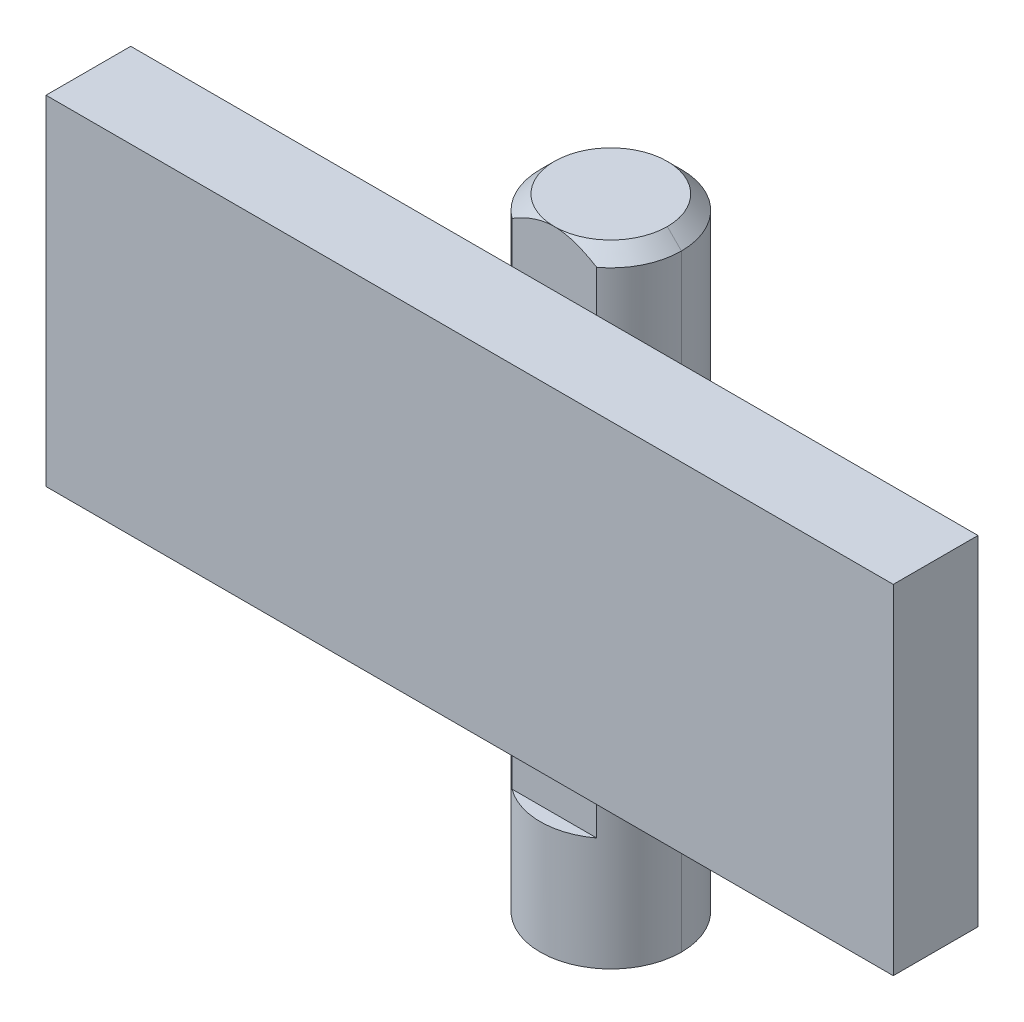
ISO-10303-21;
HEADER;
FILE_DESCRIPTION(('STEP AP214'),'2;1');
FILE_NAME('part.step','',(''),(''),'','','');
FILE_SCHEMA(('AUTOMOTIVE_DESIGN { 1 0 10303 214 1 1 1 1 }'));
ENDSEC;
DATA;
#1=APPLICATION_CONTEXT('core data for automotive mechanical design processes');
#2=APPLICATION_PROTOCOL_DEFINITION('international standard','automotive_design',2000,#1);
#3=PRODUCT_CONTEXT('',#1,'mechanical');
#4=PRODUCT('Part','Part','',(#3));
#5=PRODUCT_RELATED_PRODUCT_CATEGORY('part','',(#4));
#6=PRODUCT_DEFINITION_FORMATION('','',#4);
#7=PRODUCT_DEFINITION_CONTEXT('part definition',#1,'design');
#8=PRODUCT_DEFINITION('design','',#6,#7);
#9=PRODUCT_DEFINITION_SHAPE('','',#8);
#10=(LENGTH_UNIT() NAMED_UNIT(*) SI_UNIT(.MILLI.,.METRE.));
#11=(NAMED_UNIT(*) PLANE_ANGLE_UNIT() SI_UNIT($,.RADIAN.));
#12=(NAMED_UNIT(*) SI_UNIT($,.STERADIAN.) SOLID_ANGLE_UNIT());
#13=UNCERTAINTY_MEASURE_WITH_UNIT(LENGTH_MEASURE(1.E-05),#10,'distance_accuracy_value','');
#14=(GEOMETRIC_REPRESENTATION_CONTEXT(3) GLOBAL_UNCERTAINTY_ASSIGNED_CONTEXT((#13)) GLOBAL_UNIT_ASSIGNED_CONTEXT((#10,
#11,#12)) REPRESENTATION_CONTEXT('',''));
#15=CARTESIAN_POINT('',(0.,0.,0.));
#16=DIRECTION('',(0.,0.,1.));
#17=DIRECTION('',(1.,0.,0.));
#18=AXIS2_PLACEMENT_3D('',#15,#16,#17);
#19=CARTESIAN_POINT('',(-16.698147188712,34.073425246824,60.73181520798));
#20=DIRECTION('',(0.,0.,-1.));
#21=DIRECTION('',(-1.,0.,0.));
#22=AXIS2_PLACEMENT_3D('',#19,#20,#21);
#23=PLANE('',#22);
#24=DIRECTION('',(-1.,0.,0.));
#25=VECTOR('',#24,1.);
#26=CARTESIAN_POINT('',(-3.198147188712,50.101061355301,60.73181520798));
#27=LINE('',#26,#25);
#28=CARTESIAN_POINT('',(-16.698147188712,50.101061355301,60.73181520798));
#29=VERTEX_POINT('',#28);
#30=CARTESIAN_POINT('',(-19.698147188712,50.101061355301,60.73181520798));
#31=VERTEX_POINT('',#30);
#32=EDGE_CURVE('E73',#29,#31,#27,.T.);
#33=ORIENTED_EDGE('',*,*,#32,.F.);
#34=DIRECTION('',(0.,1.,0.));
#35=VECTOR('',#34,1.);
#36=CARTESIAN_POINT('',(-16.698147188712,34.073425246824,60.73181520798));
#37=LINE('',#36,#35);
#38=CARTESIAN_POINT('',(-16.698147188712,51.573425246824,60.73181520798));
#39=VERTEX_POINT('',#38);
#40=EDGE_CURVE('E324',#29,#39,#37,.T.);
#41=ORIENTED_EDGE('',*,*,#40,.T.);
#42=CARTESIAN_POINT('',(-16.698147188712,51.573425246824,60.73181520798));
#43=CARTESIAN_POINT('',(-17.0838822003572,51.8048662538111,60.73181520798));
#44=CARTESIAN_POINT('',(-17.4157640386026,51.9258397669012,60.73181520798));
#45=CARTESIAN_POINT('',(-17.8206538291355,52.073425246824,60.73181520798));
#46=CARTESIAN_POINT('',(-18.198147188712,52.073425246824,60.73181520798));
#47=B_SPLINE_CURVE_WITH_KNOTS('',2,(#42,#43,#44,#45,#46),.UNSPECIFIED.,.F.,.F.,(3,2,3),(0.,0.5,
1.),.UNSPECIFIED.);
#48=CARTESIAN_POINT('',(-18.198147188712,52.073425246824,60.73181520798));
#49=VERTEX_POINT('',#48);
#50=EDGE_CURVE('E65',#39,#49,#47,.T.);
#51=ORIENTED_EDGE('',*,*,#50,.T.);
#52=CARTESIAN_POINT('',(-18.198147188712,52.073425246824,60.73181520798));
#53=CARTESIAN_POINT('',(-18.5763507562841,52.073425246824,60.73181520798));
#54=CARTESIAN_POINT('',(-18.9831177525499,51.9248957994828,60.73181520798));
#55=CARTESIAN_POINT('',(-19.3133109570888,51.8043269857979,60.73181520798));
#56=CARTESIAN_POINT('',(-19.698147188712,51.573425246824,60.73181520798));
#57=B_SPLINE_CURVE_WITH_KNOTS('',2,(#52,#53,#54,#55,#56),.UNSPECIFIED.,.F.,.F.,(3,2,3),(0.,0.5,
1.),.UNSPECIFIED.);
#58=CARTESIAN_POINT('',(-19.698147188712,51.573425246824,60.73181520798));
#59=VERTEX_POINT('',#58);
#60=EDGE_CURVE('E230',#49,#59,#57,.T.);
#61=ORIENTED_EDGE('',*,*,#60,.T.);
#62=DIRECTION('',(0.,1.,0.));
#63=VECTOR('',#62,1.);
#64=CARTESIAN_POINT('',(-19.698147188712,34.073425246824,60.73181520798));
#65=LINE('',#64,#63);
#66=EDGE_CURVE('E58',#31,#59,#65,.T.);
#67=ORIENTED_EDGE('',*,*,#66,.F.);
#68=EDGE_LOOP('',(#33,#41,#51,#61,#67));
#69=FACE_BOUND('',#68,.T.);
#70=ADVANCED_FACE('F53',(#69),#23,.F.);
#71=CARTESIAN_POINT('',(-18.198147188712,34.073425246824,58.73181520798));
#72=DIRECTION('',(0.,1.,0.));
#73=DIRECTION('',(0.,0.,1.));
#74=AXIS2_PLACEMENT_3D('',#71,#72,#73);
#75=PLANE('',#74);
#76=CARTESIAN_POINT('',(-18.198147188712,34.073425246824,58.73181520798));
#77=DIRECTION('',(0.,1.,0.));
#78=DIRECTION('',(-1.,0.,0.));
#79=AXIS2_PLACEMENT_3D('',#76,#77,#78);
#80=CIRCLE('',#79,2.5);
#81=CARTESIAN_POINT('',(-19.698147188712,34.073425246824,60.73181520798));
#82=VERTEX_POINT('',#81);
#83=CARTESIAN_POINT('',(-16.698147188712,34.073425246824,60.73181520798));
#84=VERTEX_POINT('',#83);
#85=EDGE_CURVE('E203',#82,#84,#80,.T.);
#86=ORIENTED_EDGE('',*,*,#85,.T.);
#87=DIRECTION('',(-1.,0.,0.));
#88=VECTOR('',#87,1.);
#89=CARTESIAN_POINT('',(-16.698147188712,34.073425246824,60.73181520798));
#90=LINE('',#89,#88);
#91=EDGE_CURVE('E11',#84,#82,#90,.T.);
#92=ORIENTED_EDGE('',*,*,#91,.T.);
#93=EDGE_LOOP('',(#86,#92));
#94=FACE_BOUND('',#93,.T.);
#95=ADVANCED_FACE('F280',(#94),#75,.T.);
#96=CARTESIAN_POINT('',(-16.698147188712,38.101061355301,60.73181520798));
#97=VERTEX_POINT('',#96);
#98=EDGE_CURVE('E206',#84,#97,#37,.T.);
#99=ORIENTED_EDGE('',*,*,#98,.T.);
#100=DIRECTION('',(-1.,0.,0.));
#101=VECTOR('',#100,1.);
#102=CARTESIAN_POINT('',(-3.198147188712,38.101061355301,60.73181520798));
#103=LINE('',#102,#101);
#104=CARTESIAN_POINT('',(-19.698147188712,38.101061355301,60.73181520798));
#105=VERTEX_POINT('',#104);
#106=EDGE_CURVE('E194',#97,#105,#103,.T.);
#107=ORIENTED_EDGE('',*,*,#106,.T.);
#108=EDGE_CURVE('E235',#82,#105,#65,.T.);
#109=ORIENTED_EDGE('',*,*,#108,.F.);
#110=ORIENTED_EDGE('',*,*,#91,.F.);
#111=EDGE_LOOP('',(#99,#107,#109,#110));
#112=FACE_BOUND('',#111,.T.);
#113=ADVANCED_FACE('F55',(#112),#23,.F.);
#114=CARTESIAN_POINT('',(-18.198147188712,52.073425246824,58.73181520798));
#115=DIRECTION('',(0.,-1.,0.));
#116=DIRECTION('',(1.,0.,0.));
#117=AXIS2_PLACEMENT_3D('',#114,#115,#116);
#118=CONICAL_SURFACE('',#117,2.,0.785398163397446);
#119=DIRECTION('',(0.707106781186546,-0.707106781186549,0.));
#120=VECTOR('',#119,1.);
#121=CARTESIAN_POINT('',(-16.198147188712,52.073425246824,58.73181520798));
#122=LINE('',#121,#120);
#123=CARTESIAN_POINT('',(-16.198147188712,52.073425246824,58.73181520798));
#124=VERTEX_POINT('',#123);
#125=CARTESIAN_POINT('',(-15.698147188712,51.573425246824,58.73181520798));
#126=VERTEX_POINT('',#125);
#127=EDGE_CURVE('E217',#124,#126,#122,.T.);
#128=ORIENTED_EDGE('',*,*,#127,.F.);
#129=CARTESIAN_POINT('',(-18.198147188712,52.073425246824,58.73181520798));
#130=DIRECTION('',(0.,1.,0.));
#131=DIRECTION('',(-1.,0.,0.));
#132=AXIS2_PLACEMENT_3D('',#129,#130,#131);
#133=CIRCLE('',#132,2.);
#134=EDGE_CURVE('E234',#49,#124,#133,.T.);
#135=ORIENTED_EDGE('',*,*,#134,.F.);
#136=ORIENTED_EDGE('',*,*,#50,.F.);
#137=CARTESIAN_POINT('',(-18.198147188712,51.573425246824,58.73181520798));
#138=DIRECTION('',(0.,-1.,0.));
#139=DIRECTION('',(-1.,0.,0.));
#140=AXIS2_PLACEMENT_3D('',#137,#138,#139);
#141=CIRCLE('',#140,2.5);
#142=EDGE_CURVE('E226',#126,#39,#141,.T.);
#143=ORIENTED_EDGE('',*,*,#142,.F.);
#144=EDGE_LOOP('',(#128,#135,#136,#143));
#145=FACE_BOUND('',#144,.T.);
#146=ADVANCED_FACE('F262',(#145),#118,.T.);
#147=CARTESIAN_POINT('',(-18.198147188712,30.073425246824,58.73181520798));
#148=DIRECTION('',(0.,1.,0.));
#149=DIRECTION('',(0.,0.,1.));
#150=AXIS2_PLACEMENT_3D('',#147,#148,#149);
#151=PLANE('',#150);
#152=CARTESIAN_POINT('',(-18.198147188712,30.073425246824,58.73181520798));
#153=DIRECTION('',(0.,1.,0.));
#154=DIRECTION('',(-1.,0.,0.));
#155=AXIS2_PLACEMENT_3D('',#152,#153,#154);
#156=CIRCLE('',#155,2.5);
#157=CARTESIAN_POINT('',(-15.698147188712,30.073425246824,58.73181520798));
#158=VERTEX_POINT('',#157);
#159=CARTESIAN_POINT('',(-20.698147188712,30.073425246824,58.73181520798));
#160=VERTEX_POINT('',#159);
#161=EDGE_CURVE('E231',#158,#160,#156,.T.);
#162=ORIENTED_EDGE('',*,*,#161,.F.);
#163=CARTESIAN_POINT('',(-18.198147188712,30.073425246824,58.73181520798));
#164=DIRECTION('',(0.,1.,0.));
#165=DIRECTION('',(-1.,0.,0.));
#166=AXIS2_PLACEMENT_3D('',#163,#164,#165);
#167=CIRCLE('',#166,2.5);
#168=EDGE_CURVE('E221',#160,#158,#167,.T.);
#169=ORIENTED_EDGE('',*,*,#168,.F.);
#170=EDGE_LOOP('',(#162,#169));
#171=FACE_BOUND('',#170,.T.);
#172=ADVANCED_FACE('F271',(#171),#151,.F.);
#173=CARTESIAN_POINT('',(-18.198147188712,52.073425246824,58.73181520798));
#174=DIRECTION('',(0.,1.,0.));
#175=DIRECTION('',(0.,0.,1.));
#176=AXIS2_PLACEMENT_3D('',#173,#174,#175);
#177=PLANE('',#176);
#178=ORIENTED_EDGE('',*,*,#134,.T.);
#179=CARTESIAN_POINT('',(-18.198147188712,52.073425246824,58.73181520798));
#180=DIRECTION('',(0.,1.,0.));
#181=DIRECTION('',(-1.,0.,0.));
#182=AXIS2_PLACEMENT_3D('',#179,#180,#181);
#183=CIRCLE('',#182,2.);
#184=CARTESIAN_POINT('',(-20.198147188712,52.073425246824,58.73181520798));
#185=VERTEX_POINT('',#184);
#186=EDGE_CURVE('E227',#124,#185,#183,.T.);
#187=ORIENTED_EDGE('',*,*,#186,.T.);
#188=CARTESIAN_POINT('',(-18.198147188712,52.073425246824,58.73181520798));
#189=DIRECTION('',(0.,1.,0.));
#190=DIRECTION('',(-1.,0.,0.));
#191=AXIS2_PLACEMENT_3D('',#188,#189,#190);
#192=CIRCLE('',#191,2.);
#193=EDGE_CURVE('E198',#185,#49,#192,.T.);
#194=ORIENTED_EDGE('',*,*,#193,.T.);
#195=EDGE_LOOP('',(#178,#187,#194));
#196=FACE_BOUND('',#195,.T.);
#197=ADVANCED_FACE('F274',(#196),#177,.T.);
#198=CARTESIAN_POINT('',(-18.198147188712,52.073425246824,58.73181520798));
#199=DIRECTION('',(0.,-1.,0.));
#200=DIRECTION('',(1.,0.,0.));
#201=AXIS2_PLACEMENT_3D('',#198,#199,#200);
#202=CYLINDRICAL_SURFACE('',#201,2.5);
#203=DIRECTION('',(0.,-1.,0.));
#204=VECTOR('',#203,1.);
#205=CARTESIAN_POINT('',(-20.698147188712,52.073425246824,58.73181520798));
#206=LINE('',#205,#204);
#207=CARTESIAN_POINT('',(-20.698147188712,51.573425246824,58.73181520798));
#208=VERTEX_POINT('',#207);
#209=EDGE_CURVE('E216',#208,#160,#206,.T.);
#210=ORIENTED_EDGE('',*,*,#209,.F.);
#211=CARTESIAN_POINT('',(-18.198147188712,51.573425246824,58.73181520798));
#212=DIRECTION('',(0.,-1.,0.));
#213=DIRECTION('',(-1.,0.,0.));
#214=AXIS2_PLACEMENT_3D('',#211,#212,#213);
#215=CIRCLE('',#214,2.5);
#216=EDGE_CURVE('E212',#208,#126,#215,.T.);
#217=ORIENTED_EDGE('',*,*,#216,.T.);
#218=DIRECTION('',(0.,-1.,0.));
#219=VECTOR('',#218,1.);
#220=CARTESIAN_POINT('',(-15.698147188712,52.073425246824,58.73181520798));
#221=LINE('',#220,#219);
#222=EDGE_CURVE('E222',#126,#158,#221,.T.);
#223=ORIENTED_EDGE('',*,*,#222,.T.);
#224=ORIENTED_EDGE('',*,*,#161,.T.);
#225=EDGE_LOOP('',(#210,#217,#223,#224));
#226=FACE_BOUND('',#225,.T.);
#227=ADVANCED_FACE('F278',(#226),#202,.T.);
#228=CARTESIAN_POINT('',(-18.198147188712,52.073425246824,58.73181520798));
#229=DIRECTION('',(0.,-1.,0.));
#230=DIRECTION('',(1.,0.,0.));
#231=AXIS2_PLACEMENT_3D('',#228,#229,#230);
#232=CYLINDRICAL_SURFACE('',#231,2.5);
#233=CARTESIAN_POINT('',(-18.198147188712,51.573425246824,58.73181520798));
#234=DIRECTION('',(0.,-1.,0.));
#235=DIRECTION('',(-1.,0.,0.));
#236=AXIS2_PLACEMENT_3D('',#233,#234,#235);
#237=CIRCLE('',#236,2.5);
#238=EDGE_CURVE('E211',#59,#208,#237,.T.);
#239=ORIENTED_EDGE('',*,*,#238,.T.);
#240=ORIENTED_EDGE('',*,*,#209,.T.);
#241=ORIENTED_EDGE('',*,*,#168,.T.);
#242=ORIENTED_EDGE('',*,*,#222,.F.);
#243=ORIENTED_EDGE('',*,*,#142,.T.);
#244=ORIENTED_EDGE('',*,*,#40,.F.);
#245=EDGE_CURVE('E327',#97,#29,#37,.T.);
#246=ORIENTED_EDGE('',*,*,#245,.F.);
#247=ORIENTED_EDGE('',*,*,#98,.F.);
#248=ORIENTED_EDGE('',*,*,#85,.F.);
#249=ORIENTED_EDGE('',*,*,#108,.T.);
#250=EDGE_CURVE('E315',#105,#31,#65,.T.);
#251=ORIENTED_EDGE('',*,*,#250,.T.);
#252=ORIENTED_EDGE('',*,*,#66,.T.);
#253=EDGE_LOOP('',(#239,#240,#241,#242,#243,#244,#246,#247,#248,#249,#251,#252));
#254=FACE_BOUND('',#253,.T.);
#255=ADVANCED_FACE('F285',(#254),#232,.T.);
#256=CARTESIAN_POINT('',(-18.198147188712,52.073425246824,58.73181520798));
#257=DIRECTION('',(0.,-1.,0.));
#258=DIRECTION('',(1.,0.,0.));
#259=AXIS2_PLACEMENT_3D('',#256,#257,#258);
#260=CONICAL_SURFACE('',#259,2.,0.785398163397446);
#261=DIRECTION('',(-0.707106781186546,-0.707106781186549,0.));
#262=VECTOR('',#261,1.);
#263=CARTESIAN_POINT('',(-20.198147188712,52.073425246824,58.73181520798));
#264=LINE('',#263,#262);
#265=EDGE_CURVE('E207',#185,#208,#264,.T.);
#266=ORIENTED_EDGE('',*,*,#265,.F.);
#267=ORIENTED_EDGE('',*,*,#186,.F.);
#268=ORIENTED_EDGE('',*,*,#127,.T.);
#269=ORIENTED_EDGE('',*,*,#216,.F.);
#270=EDGE_LOOP('',(#266,#267,#268,#269));
#271=FACE_BOUND('',#270,.T.);
#272=ADVANCED_FACE('F289',(#271),#260,.T.);
#273=CARTESIAN_POINT('',(-18.198147188712,52.073425246824,58.73181520798));
#274=DIRECTION('',(0.,-1.,0.));
#275=DIRECTION('',(1.,0.,0.));
#276=AXIS2_PLACEMENT_3D('',#273,#274,#275);
#277=CONICAL_SURFACE('',#276,2.,0.785398163397446);
#278=ORIENTED_EDGE('',*,*,#193,.F.);
#279=ORIENTED_EDGE('',*,*,#265,.T.);
#280=ORIENTED_EDGE('',*,*,#238,.F.);
#281=ORIENTED_EDGE('',*,*,#60,.F.);
#282=EDGE_LOOP('',(#278,#279,#280,#281));
#283=FACE_BOUND('',#282,.T.);
#284=ADVANCED_FACE('F293',(#283),#277,.T.);
#285=CARTESIAN_POINT('',(0.,0.,60.73181520798));
#286=DIRECTION('',(0.,0.,-1.));
#287=DIRECTION('',(-1.,0.,0.));
#288=AXIS2_PLACEMENT_3D('',#285,#286,#287);
#289=PLANE('',#288);
#290=CARTESIAN_POINT('',(-3.198147188712,38.101061355301,60.73181520798));
#291=VERTEX_POINT('',#290);
#292=EDGE_CURVE('E163',#291,#97,#103,.T.);
#293=ORIENTED_EDGE('',*,*,#292,.T.);
#294=ORIENTED_EDGE('',*,*,#245,.T.);
#295=CARTESIAN_POINT('',(-3.198147188712,50.101061355301,60.73181520798));
#296=VERTEX_POINT('',#295);
#297=EDGE_CURVE('E182',#296,#29,#27,.T.);
#298=ORIENTED_EDGE('',*,*,#297,.F.);
#299=DIRECTION('',(0.,-1.,0.));
#300=VECTOR('',#299,1.);
#301=CARTESIAN_POINT('',(-3.198147188712,50.101061355301,60.73181520798));
#302=LINE('',#301,#300);
#303=EDGE_CURVE('E189',#296,#291,#302,.T.);
#304=ORIENTED_EDGE('',*,*,#303,.T.);
#305=EDGE_LOOP('',(#293,#294,#298,#304));
#306=FACE_BOUND('',#305,.T.);
#307=ADVANCED_FACE('F298',(#306),#289,.T.);
#308=CARTESIAN_POINT('',(-3.198147188712,50.101061355301,63.73181520798));
#309=DIRECTION('',(1.,0.,0.));
#310=DIRECTION('',(0.,0.,-1.));
#311=AXIS2_PLACEMENT_3D('',#308,#309,#310);
#312=PLANE('',#311);
#313=ORIENTED_EDGE('',*,*,#303,.F.);
#314=DIRECTION('',(0.,0.,-1.));
#315=VECTOR('',#314,1.);
#316=CARTESIAN_POINT('',(-3.198147188712,50.101061355301,63.73181520798));
#317=LINE('',#316,#315);
#318=CARTESIAN_POINT('',(-3.198147188712,50.101061355301,63.73181520798));
#319=VERTEX_POINT('',#318);
#320=EDGE_CURVE('E180',#319,#296,#317,.T.);
#321=ORIENTED_EDGE('',*,*,#320,.F.);
#322=DIRECTION('',(0.,-1.,0.));
#323=VECTOR('',#322,1.);
#324=CARTESIAN_POINT('',(-3.198147188712,50.101061355301,63.73181520798));
#325=LINE('',#324,#323);
#326=CARTESIAN_POINT('',(-3.198147188712,38.101061355301,63.73181520798));
#327=VERTEX_POINT('',#326);
#328=EDGE_CURVE('E174',#319,#327,#325,.T.);
#329=ORIENTED_EDGE('',*,*,#328,.T.);
#330=DIRECTION('',(0.,0.,-1.));
#331=VECTOR('',#330,1.);
#332=CARTESIAN_POINT('',(-3.198147188712,38.101061355301,63.73181520798));
#333=LINE('',#332,#331);
#334=EDGE_CURVE('E157',#327,#291,#333,.T.);
#335=ORIENTED_EDGE('',*,*,#334,.T.);
#336=EDGE_LOOP('',(#313,#321,#329,#335));
#337=FACE_BOUND('',#336,.T.);
#338=ADVANCED_FACE('F179',(#337),#312,.T.);
#339=CARTESIAN_POINT('',(-3.198147188712,50.101061355301,63.73181520798));
#340=DIRECTION('',(0.,-1.,0.));
#341=DIRECTION('',(0.,0.,-1.));
#342=AXIS2_PLACEMENT_3D('',#339,#340,#341);
#343=PLANE('',#342);
#344=ORIENTED_EDGE('',*,*,#297,.T.);
#345=ORIENTED_EDGE('',*,*,#32,.T.);
#346=CARTESIAN_POINT('',(-33.198147188712,50.101061355301,60.73181520798));
#347=VERTEX_POINT('',#346);
#348=EDGE_CURVE('E185',#31,#347,#27,.T.);
#349=ORIENTED_EDGE('',*,*,#348,.T.);
#350=DIRECTION('',(0.,0.,-1.));
#351=VECTOR('',#350,1.);
#352=CARTESIAN_POINT('',(-33.198147188712,50.101061355301,63.73181520798));
#353=LINE('',#352,#351);
#354=CARTESIAN_POINT('',(-33.198147188712,50.101061355301,63.73181520798));
#355=VERTEX_POINT('',#354);
#356=EDGE_CURVE('E199',#355,#347,#353,.T.);
#357=ORIENTED_EDGE('',*,*,#356,.F.);
#358=DIRECTION('',(-1.,0.,0.));
#359=VECTOR('',#358,1.);
#360=CARTESIAN_POINT('',(-3.198147188712,50.101061355301,63.73181520798));
#361=LINE('',#360,#359);
#362=EDGE_CURVE('E169',#319,#355,#361,.T.);
#363=ORIENTED_EDGE('',*,*,#362,.F.);
#364=ORIENTED_EDGE('',*,*,#320,.T.);
#365=EDGE_LOOP('',(#344,#345,#349,#357,#363,#364));
#366=FACE_BOUND('',#365,.T.);
#367=ADVANCED_FACE('F537',(#366),#343,.F.);
#368=CARTESIAN_POINT('',(-33.198147188712,50.101061355301,63.73181520798));
#369=DIRECTION('',(1.,0.,0.));
#370=DIRECTION('',(0.,0.,-1.));
#371=AXIS2_PLACEMENT_3D('',#368,#369,#370);
#372=PLANE('',#371);
#373=DIRECTION('',(0.,-1.,0.));
#374=VECTOR('',#373,1.);
#375=CARTESIAN_POINT('',(-33.198147188712,50.101061355301,60.73181520798));
#376=LINE('',#375,#374);
#377=CARTESIAN_POINT('',(-33.198147188712,38.101061355301,60.73181520798));
#378=VERTEX_POINT('',#377);
#379=EDGE_CURVE('E193',#347,#378,#376,.T.);
#380=ORIENTED_EDGE('',*,*,#379,.T.);
#381=DIRECTION('',(0.,0.,-1.));
#382=VECTOR('',#381,1.);
#383=CARTESIAN_POINT('',(-33.198147188712,38.101061355301,63.73181520798));
#384=LINE('',#383,#382);
#385=CARTESIAN_POINT('',(-33.198147188712,38.101061355301,63.73181520798));
#386=VERTEX_POINT('',#385);
#387=EDGE_CURVE('E168',#386,#378,#384,.T.);
#388=ORIENTED_EDGE('',*,*,#387,.F.);
#389=DIRECTION('',(0.,-1.,0.));
#390=VECTOR('',#389,1.);
#391=CARTESIAN_POINT('',(-33.198147188712,50.101061355301,63.73181520798));
#392=LINE('',#391,#390);
#393=EDGE_CURVE('E176',#355,#386,#392,.T.);
#394=ORIENTED_EDGE('',*,*,#393,.F.);
#395=ORIENTED_EDGE('',*,*,#356,.T.);
#396=EDGE_LOOP('',(#380,#388,#394,#395));
#397=FACE_BOUND('',#396,.T.);
#398=ADVANCED_FACE('F545',(#397),#372,.F.);
#399=CARTESIAN_POINT('',(-3.198147188712,38.101061355301,63.73181520798));
#400=DIRECTION('',(0.,-1.,0.));
#401=DIRECTION('',(0.,0.,-1.));
#402=AXIS2_PLACEMENT_3D('',#399,#400,#401);
#403=PLANE('',#402);
#404=ORIENTED_EDGE('',*,*,#292,.F.);
#405=ORIENTED_EDGE('',*,*,#334,.F.);
#406=DIRECTION('',(-1.,0.,0.));
#407=VECTOR('',#406,1.);
#408=CARTESIAN_POINT('',(-3.198147188712,38.101061355301,63.73181520798));
#409=LINE('',#408,#407);
#410=EDGE_CURVE('E161',#327,#386,#409,.T.);
#411=ORIENTED_EDGE('',*,*,#410,.T.);
#412=ORIENTED_EDGE('',*,*,#387,.T.);
#413=EDGE_CURVE('E191',#105,#378,#103,.T.);
#414=ORIENTED_EDGE('',*,*,#413,.F.);
#415=ORIENTED_EDGE('',*,*,#106,.F.);
#416=EDGE_LOOP('',(#404,#405,#411,#412,#414,#415));
#417=FACE_BOUND('',#416,.T.);
#418=ADVANCED_FACE('F159',(#417),#403,.T.);
#419=CARTESIAN_POINT('',(0.,0.,63.73181520798));
#420=DIRECTION('',(0.,0.,-1.));
#421=DIRECTION('',(-1.,0.,0.));
#422=AXIS2_PLACEMENT_3D('',#419,#420,#421);
#423=PLANE('',#422);
#424=ORIENTED_EDGE('',*,*,#328,.F.);
#425=ORIENTED_EDGE('',*,*,#362,.T.);
#426=ORIENTED_EDGE('',*,*,#393,.T.);
#427=ORIENTED_EDGE('',*,*,#410,.F.);
#428=EDGE_LOOP('',(#424,#425,#426,#427));
#429=FACE_BOUND('',#428,.T.);
#430=ADVANCED_FACE('F173',(#429),#423,.F.);
#431=ORIENTED_EDGE('',*,*,#348,.F.);
#432=ORIENTED_EDGE('',*,*,#250,.F.);
#433=ORIENTED_EDGE('',*,*,#413,.T.);
#434=ORIENTED_EDGE('',*,*,#379,.F.);
#435=EDGE_LOOP('',(#431,#432,#433,#434));
#436=FACE_BOUND('',#435,.T.);
#437=ADVANCED_FACE('F529',(#436),#289,.T.);
#438=CLOSED_SHELL('',(#70,#95,#113,#146,#172,#197,#227,#255,#272,#284,#307,#338,#367,#398,#418,
#430,#437));
#439=MANIFOLD_SOLID_BREP('B2',#438);
#440=ADVANCED_BREP_SHAPE_REPRESENTATION('',(#18,#439),#14);
#441=SHAPE_DEFINITION_REPRESENTATION(#9,#440);
ENDSEC;
END-ISO-10303-21;
